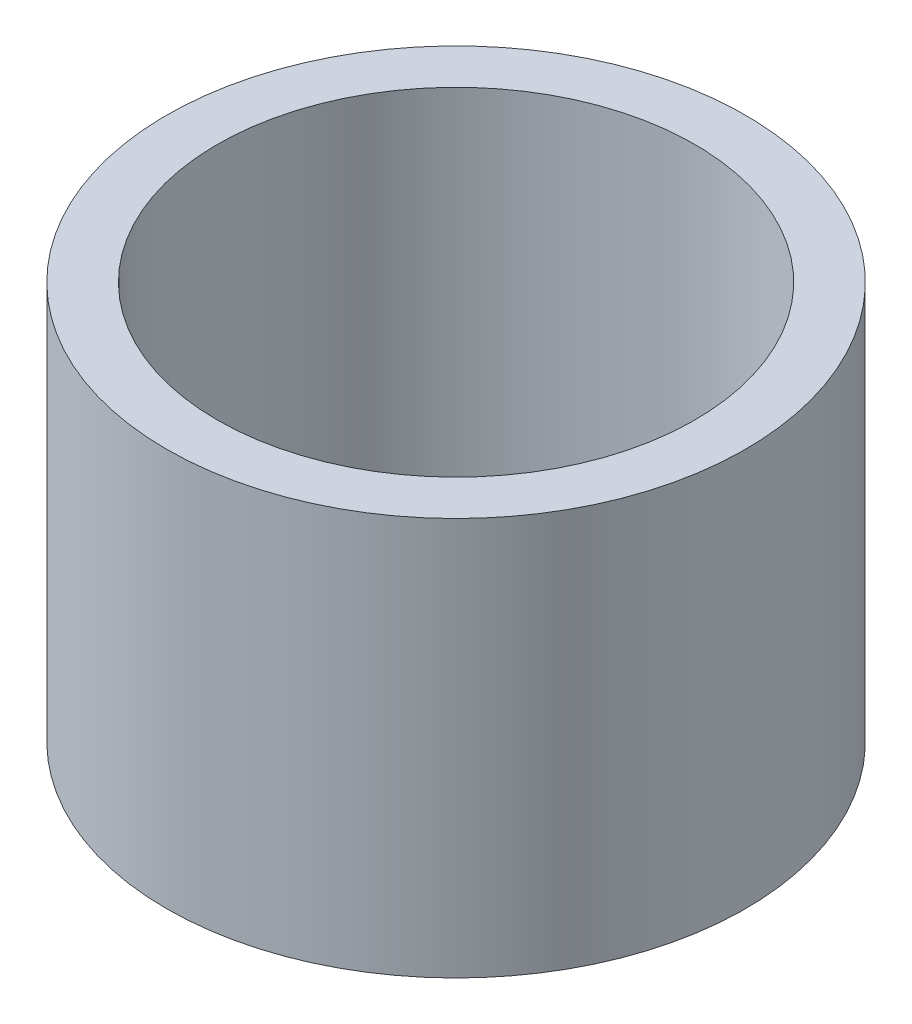
ISO-10303-21;
HEADER;
FILE_DESCRIPTION(('STEP AP214'),'2;1');
FILE_NAME('part.step','',(''),(''),'','','');
FILE_SCHEMA(('AUTOMOTIVE_DESIGN { 1 0 10303 214 1 1 1 1 }'));
ENDSEC;
DATA;
#1=APPLICATION_CONTEXT('core data for automotive mechanical design processes');
#2=APPLICATION_PROTOCOL_DEFINITION('international standard','automotive_design',2000,#1);
#3=PRODUCT_CONTEXT('',#1,'mechanical');
#4=PRODUCT('Part','Part','',(#3));
#5=PRODUCT_RELATED_PRODUCT_CATEGORY('part','',(#4));
#6=PRODUCT_DEFINITION_FORMATION('','',#4);
#7=PRODUCT_DEFINITION_CONTEXT('part definition',#1,'design');
#8=PRODUCT_DEFINITION('design','',#6,#7);
#9=PRODUCT_DEFINITION_SHAPE('','',#8);
#10=(LENGTH_UNIT() NAMED_UNIT(*) SI_UNIT(.MILLI.,.METRE.));
#11=(NAMED_UNIT(*) PLANE_ANGLE_UNIT() SI_UNIT($,.RADIAN.));
#12=(NAMED_UNIT(*) SI_UNIT($,.STERADIAN.) SOLID_ANGLE_UNIT());
#13=UNCERTAINTY_MEASURE_WITH_UNIT(LENGTH_MEASURE(1.E-05),#10,'distance_accuracy_value','');
#14=(GEOMETRIC_REPRESENTATION_CONTEXT(3) GLOBAL_UNCERTAINTY_ASSIGNED_CONTEXT((#13)) GLOBAL_UNIT_ASSIGNED_CONTEXT((#10,
#11,#12)) REPRESENTATION_CONTEXT('',''));
#15=CARTESIAN_POINT('',(0.,0.,0.));
#16=DIRECTION('',(0.,0.,1.));
#17=DIRECTION('',(1.,0.,0.));
#18=AXIS2_PLACEMENT_3D('',#15,#16,#17);
#19=CARTESIAN_POINT('',(0.,5.5,0.));
#20=DIRECTION('',(0.,1.,0.));
#21=DIRECTION('',(0.,0.,1.));
#22=AXIS2_PLACEMENT_3D('',#19,#20,#21);
#23=PLANE('',#22);
#24=CARTESIAN_POINT('',(0.,5.5,0.));
#25=DIRECTION('',(0.,1.,0.));
#26=DIRECTION('',(0.,0.,1.));
#27=AXIS2_PLACEMENT_3D('',#24,#25,#26);
#28=CIRCLE('',#27,4.);
#29=CARTESIAN_POINT('',(0.,5.5,4.));
#30=VERTEX_POINT('',#29);
#31=EDGE_CURVE('E10',#30,#30,#28,.T.);
#32=ORIENTED_EDGE('',*,*,#31,.T.);
#33=EDGE_LOOP('',(#32));
#34=FACE_BOUND('',#33,.T.);
#35=CARTESIAN_POINT('',(0.,5.5,0.));
#36=DIRECTION('',(0.,1.,0.));
#37=DIRECTION('',(0.,0.,1.));
#38=AXIS2_PLACEMENT_3D('',#35,#36,#37);
#39=CIRCLE('',#38,3.3);
#40=CARTESIAN_POINT('',(0.,5.5,3.3));
#41=VERTEX_POINT('',#40);
#42=EDGE_CURVE('E42',#41,#41,#39,.T.);
#43=ORIENTED_EDGE('',*,*,#42,.F.);
#44=EDGE_LOOP('',(#43));
#45=FACE_BOUND('',#44,.T.);
#46=ADVANCED_FACE('F31',(#34,#45),#23,.T.);
#47=CARTESIAN_POINT('',(0.,0.,0.));
#48=DIRECTION('',(0.,1.,0.));
#49=DIRECTION('',(0.,0.,1.));
#50=AXIS2_PLACEMENT_3D('',#47,#48,#49);
#51=PLANE('',#50);
#52=CARTESIAN_POINT('',(0.,0.,0.));
#53=DIRECTION('',(0.,1.,0.));
#54=DIRECTION('',(0.,0.,1.));
#55=AXIS2_PLACEMENT_3D('',#52,#53,#54);
#56=CIRCLE('',#55,4.);
#57=CARTESIAN_POINT('',(0.,0.,4.));
#58=VERTEX_POINT('',#57);
#59=EDGE_CURVE('E35',#58,#58,#56,.T.);
#60=ORIENTED_EDGE('',*,*,#59,.F.);
#61=EDGE_LOOP('',(#60));
#62=FACE_BOUND('',#61,.T.);
#63=CARTESIAN_POINT('',(0.,0.,0.));
#64=DIRECTION('',(0.,1.,0.));
#65=DIRECTION('',(0.,0.,1.));
#66=AXIS2_PLACEMENT_3D('',#63,#64,#65);
#67=CIRCLE('',#66,3.3);
#68=CARTESIAN_POINT('',(0.,0.,3.3));
#69=VERTEX_POINT('',#68);
#70=EDGE_CURVE('E44',#69,#69,#67,.T.);
#71=ORIENTED_EDGE('',*,*,#70,.T.);
#72=EDGE_LOOP('',(#71));
#73=FACE_BOUND('',#72,.T.);
#74=ADVANCED_FACE('F54',(#62,#73),#51,.F.);
#75=CARTESIAN_POINT('',(0.,5.5,0.));
#76=DIRECTION('',(0.,-1.,0.));
#77=DIRECTION('',(0.,0.,-1.));
#78=AXIS2_PLACEMENT_3D('',#75,#76,#77);
#79=CYLINDRICAL_SURFACE('',#78,4.);
#80=ORIENTED_EDGE('',*,*,#31,.F.);
#81=EDGE_LOOP('',(#80));
#82=FACE_BOUND('',#81,.T.);
#83=ORIENTED_EDGE('',*,*,#59,.T.);
#84=EDGE_LOOP('',(#83));
#85=FACE_BOUND('',#84,.T.);
#86=ADVANCED_FACE('F33',(#82,#85),#79,.T.);
#87=CARTESIAN_POINT('',(0.,5.5,0.));
#88=DIRECTION('',(0.,-1.,0.));
#89=DIRECTION('',(0.,0.,-1.));
#90=AXIS2_PLACEMENT_3D('',#87,#88,#89);
#91=CYLINDRICAL_SURFACE('',#90,3.3);
#92=ORIENTED_EDGE('',*,*,#42,.T.);
#93=EDGE_LOOP('',(#92));
#94=FACE_BOUND('',#93,.T.);
#95=ORIENTED_EDGE('',*,*,#70,.F.);
#96=EDGE_LOOP('',(#95));
#97=FACE_BOUND('',#96,.T.);
#98=ADVANCED_FACE('F50',(#94,#97),#91,.F.);
#99=CLOSED_SHELL('',(#46,#74,#86,#98));
#100=MANIFOLD_SOLID_BREP('B2',#99);
#101=ADVANCED_BREP_SHAPE_REPRESENTATION('',(#18,#100),#14);
#102=SHAPE_DEFINITION_REPRESENTATION(#9,#101);
ENDSEC;
END-ISO-10303-21;
